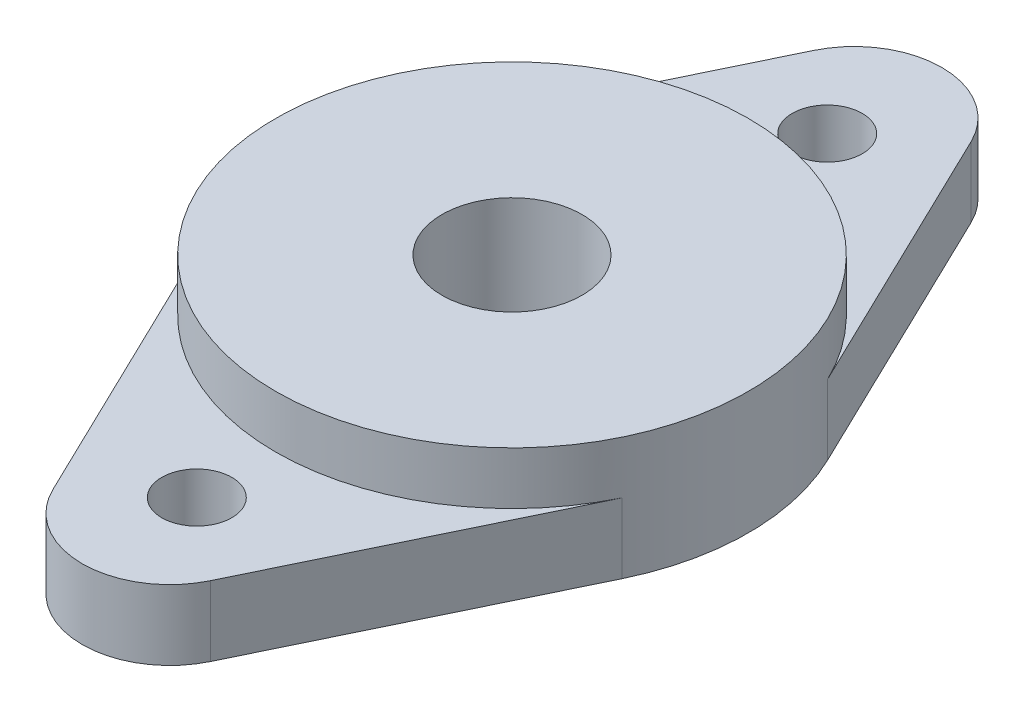
ISO-10303-21;
HEADER;
FILE_DESCRIPTION(('STEP AP214'),'2;1');
FILE_NAME('part.step','',(''),(''),'','','');
FILE_SCHEMA(('AUTOMOTIVE_DESIGN { 1 0 10303 214 1 1 1 1 }'));
ENDSEC;
DATA;
#1=APPLICATION_CONTEXT('core data for automotive mechanical design processes');
#2=APPLICATION_PROTOCOL_DEFINITION('international standard','automotive_design',2000,#1);
#3=PRODUCT_CONTEXT('',#1,'mechanical');
#4=PRODUCT('Part','Part','',(#3));
#5=PRODUCT_RELATED_PRODUCT_CATEGORY('part','',(#4));
#6=PRODUCT_DEFINITION_FORMATION('','',#4);
#7=PRODUCT_DEFINITION_CONTEXT('part definition',#1,'design');
#8=PRODUCT_DEFINITION('design','',#6,#7);
#9=PRODUCT_DEFINITION_SHAPE('','',#8);
#10=(LENGTH_UNIT() NAMED_UNIT(*) SI_UNIT(.MILLI.,.METRE.));
#11=(NAMED_UNIT(*) PLANE_ANGLE_UNIT() SI_UNIT($,.RADIAN.));
#12=(NAMED_UNIT(*) SI_UNIT($,.STERADIAN.) SOLID_ANGLE_UNIT());
#13=UNCERTAINTY_MEASURE_WITH_UNIT(LENGTH_MEASURE(1.E-05),#10,'distance_accuracy_value','');
#14=(GEOMETRIC_REPRESENTATION_CONTEXT(3) GLOBAL_UNCERTAINTY_ASSIGNED_CONTEXT((#13)) GLOBAL_UNIT_ASSIGNED_CONTEXT((#10,
#11,#12)) REPRESENTATION_CONTEXT('',''));
#15=CARTESIAN_POINT('',(0.,0.,0.));
#16=DIRECTION('',(0.,0.,1.));
#17=DIRECTION('',(1.,0.,0.));
#18=AXIS2_PLACEMENT_3D('',#15,#16,#17);
#19=CARTESIAN_POINT('',(0.,4.,0.));
#20=DIRECTION('',(0.,1.,0.));
#21=DIRECTION('',(0.,0.,1.));
#22=AXIS2_PLACEMENT_3D('',#19,#20,#21);
#23=PLANE('',#22);
#24=CARTESIAN_POINT('',(0.,4.,0.));
#25=DIRECTION('',(0.,1.,0.));
#26=DIRECTION('',(0.,0.,1.));
#27=AXIS2_PLACEMENT_3D('',#24,#25,#26);
#28=CIRCLE('',#27,13.5);
#29=CARTESIAN_POINT('',(12.1564372844206,4.,-5.87120367130518));
#30=VERTEX_POINT('',#29);
#31=CARTESIAN_POINT('',(-12.1564372844206,4.,-5.87120367130518));
#32=VERTEX_POINT('',#31);
#33=EDGE_CURVE('E11',#30,#32,#28,.T.);
#34=ORIENTED_EDGE('',*,*,#33,.F.);
#35=DIRECTION('',(-0.434903975652235,0.,-0.900476835883012));
#36=VECTOR('',#35,1.);
#37=CARTESIAN_POINT('',(12.1564372844206,4.,-5.87120367130516));
#38=LINE('',#37,#36);
#39=CARTESIAN_POINT('',(4.50238417941506,4.,-21.7190641359961));
#40=VERTEX_POINT('',#39);
#41=EDGE_CURVE('E155',#30,#40,#38,.T.);
#42=ORIENTED_EDGE('',*,*,#41,.T.);
#43=CARTESIAN_POINT('',(0.,4.,-19.5445442577349));
#44=DIRECTION('',(0.,1.,0.));
#45=DIRECTION('',(0.,0.,1.));
#46=AXIS2_PLACEMENT_3D('',#43,#44,#45);
#47=CIRCLE('',#46,5.);
#48=CARTESIAN_POINT('',(-4.50238417941506,4.,-21.7190641359961));
#49=VERTEX_POINT('',#48);
#50=EDGE_CURVE('E133',#40,#49,#47,.T.);
#51=ORIENTED_EDGE('',*,*,#50,.T.);
#52=DIRECTION('',(-0.434903975652235,0.,0.900476835883012));
#53=VECTOR('',#52,1.);
#54=CARTESIAN_POINT('',(-12.1564372844206,4.,-5.87120367130516));
#55=LINE('',#54,#53);
#56=EDGE_CURVE('E130',#49,#32,#55,.T.);
#57=ORIENTED_EDGE('',*,*,#56,.T.);
#58=EDGE_LOOP('',(#34,#42,#51,#57));
#59=FACE_BOUND('',#58,.T.);
#60=CARTESIAN_POINT('',(0.,4.,-18.));
#61=DIRECTION('',(0.,1.,0.));
#62=DIRECTION('',(0.,0.,1.));
#63=AXIS2_PLACEMENT_3D('',#60,#61,#62);
#64=CIRCLE('',#63,2.);
#65=CARTESIAN_POINT('',(0.,4.,-16.));
#66=VERTEX_POINT('',#65);
#67=EDGE_CURVE('E211',#66,#66,#64,.T.);
#68=ORIENTED_EDGE('',*,*,#67,.F.);
#69=EDGE_LOOP('',(#68));
#70=FACE_BOUND('',#69,.T.);
#71=ADVANCED_FACE('F35',(#59,#70),#23,.T.);
#72=CARTESIAN_POINT('',(12.1564372844206,4.,-5.87120367130516));
#73=DIRECTION('',(-0.900476835883012,0.,0.434903975652235));
#74=DIRECTION('',(0.434903975652235,0.,0.900476835883012));
#75=AXIS2_PLACEMENT_3D('',#72,#73,#74);
#76=PLANE('',#75);
#77=DIRECTION('',(-0.434903975652235,0.,-0.900476835883012));
#78=VECTOR('',#77,1.);
#79=CARTESIAN_POINT('',(12.1564372844206,0.,-5.87120367130516));
#80=LINE('',#79,#78);
#81=CARTESIAN_POINT('',(12.1564372844206,0.,-5.87120367130518));
#82=VERTEX_POINT('',#81);
#83=CARTESIAN_POINT('',(4.50238417941506,0.,-21.7190641359961));
#84=VERTEX_POINT('',#83);
#85=EDGE_CURVE('E140',#82,#84,#80,.T.);
#86=ORIENTED_EDGE('',*,*,#85,.T.);
#87=DIRECTION('',(0.,-1.,0.));
#88=VECTOR('',#87,1.);
#89=CARTESIAN_POINT('',(4.50238417941506,4.,-21.7190641359961));
#90=LINE('',#89,#88);
#91=EDGE_CURVE('E162',#40,#84,#90,.T.);
#92=ORIENTED_EDGE('',*,*,#91,.F.);
#93=ORIENTED_EDGE('',*,*,#41,.F.);
#94=DIRECTION('',(0.,-1.,0.));
#95=VECTOR('',#94,1.);
#96=CARTESIAN_POINT('',(12.1564372844206,4.,-5.87120367130518));
#97=LINE('',#96,#95);
#98=EDGE_CURVE('E39',#30,#82,#97,.T.);
#99=ORIENTED_EDGE('',*,*,#98,.T.);
#100=EDGE_LOOP('',(#86,#92,#93,#99));
#101=FACE_BOUND('',#100,.T.);
#102=ADVANCED_FACE('F37',(#101),#76,.F.);
#103=CARTESIAN_POINT('',(0.,4.,-19.5445442577349));
#104=DIRECTION('',(0.,-1.,0.));
#105=DIRECTION('',(0.,0.,-1.));
#106=AXIS2_PLACEMENT_3D('',#103,#104,#105);
#107=CYLINDRICAL_SURFACE('',#106,5.);
#108=CARTESIAN_POINT('',(0.,0.,-19.5445442577349));
#109=DIRECTION('',(0.,1.,0.));
#110=DIRECTION('',(0.,0.,1.));
#111=AXIS2_PLACEMENT_3D('',#108,#109,#110);
#112=CIRCLE('',#111,5.);
#113=CARTESIAN_POINT('',(-4.50238417941506,0.,-21.7190641359961));
#114=VERTEX_POINT('',#113);
#115=EDGE_CURVE('E143',#84,#114,#112,.T.);
#116=ORIENTED_EDGE('',*,*,#115,.T.);
#117=DIRECTION('',(0.,-1.,0.));
#118=VECTOR('',#117,1.);
#119=CARTESIAN_POINT('',(-4.50238417941506,4.,-21.7190641359961));
#120=LINE('',#119,#118);
#121=EDGE_CURVE('E160',#49,#114,#120,.T.);
#122=ORIENTED_EDGE('',*,*,#121,.F.);
#123=ORIENTED_EDGE('',*,*,#50,.F.);
#124=ORIENTED_EDGE('',*,*,#91,.T.);
#125=EDGE_LOOP('',(#116,#122,#123,#124));
#126=FACE_BOUND('',#125,.T.);
#127=ADVANCED_FACE('F188',(#126),#107,.T.);
#128=CARTESIAN_POINT('',(-12.1564372844206,4.,-5.87120367130516));
#129=DIRECTION('',(0.900476835883012,0.,0.434903975652235));
#130=DIRECTION('',(0.434903975652235,0.,-0.900476835883012));
#131=AXIS2_PLACEMENT_3D('',#128,#129,#130);
#132=PLANE('',#131);
#133=DIRECTION('',(-0.434903975652235,0.,0.900476835883012));
#134=VECTOR('',#133,1.);
#135=CARTESIAN_POINT('',(-12.1564372844206,0.,-5.87120367130516));
#136=LINE('',#135,#134);
#137=CARTESIAN_POINT('',(-12.1564372844206,0.,-5.87120367130518));
#138=VERTEX_POINT('',#137);
#139=EDGE_CURVE('E145',#114,#138,#136,.T.);
#140=ORIENTED_EDGE('',*,*,#139,.T.);
#141=DIRECTION('',(0.,-1.,0.));
#142=VECTOR('',#141,1.);
#143=CARTESIAN_POINT('',(-12.1564372844206,4.,-5.87120367130518));
#144=LINE('',#143,#142);
#145=EDGE_CURVE('E125',#32,#138,#144,.T.);
#146=ORIENTED_EDGE('',*,*,#145,.F.);
#147=ORIENTED_EDGE('',*,*,#56,.F.);
#148=ORIENTED_EDGE('',*,*,#121,.T.);
#149=EDGE_LOOP('',(#140,#146,#147,#148));
#150=FACE_BOUND('',#149,.T.);
#151=ADVANCED_FACE('F225',(#150),#132,.F.);
#152=CARTESIAN_POINT('',(0.,4.,0.));
#153=DIRECTION('',(0.,-1.,0.));
#154=DIRECTION('',(0.,0.,-1.));
#155=AXIS2_PLACEMENT_3D('',#152,#153,#154);
#156=CYLINDRICAL_SURFACE('',#155,13.5);
#157=CARTESIAN_POINT('',(0.,0.,0.));
#158=DIRECTION('',(0.,1.,0.));
#159=DIRECTION('',(0.,0.,1.));
#160=AXIS2_PLACEMENT_3D('',#157,#158,#159);
#161=CIRCLE('',#160,13.5);
#162=CARTESIAN_POINT('',(-12.1564372844206,0.,5.87120367130518));
#163=VERTEX_POINT('',#162);
#164=EDGE_CURVE('E121',#138,#163,#161,.T.);
#165=ORIENTED_EDGE('',*,*,#164,.T.);
#166=DIRECTION('',(0.,-1.,0.));
#167=VECTOR('',#166,1.);
#168=CARTESIAN_POINT('',(-12.1564372844206,4.,5.87120367130518));
#169=LINE('',#168,#167);
#170=CARTESIAN_POINT('',(-12.1564372844206,4.,5.87120367130518));
#171=VERTEX_POINT('',#170);
#172=EDGE_CURVE('E116',#171,#163,#169,.T.);
#173=ORIENTED_EDGE('',*,*,#172,.F.);
#174=CARTESIAN_POINT('',(12.1564372844207,4.,5.87120367130517));
#175=VERTEX_POINT('',#174);
#176=EDGE_CURVE('E45',#171,#175,#28,.T.);
#177=ORIENTED_EDGE('',*,*,#176,.T.);
#178=DIRECTION('',(0.,-1.,0.));
#179=VECTOR('',#178,1.);
#180=CARTESIAN_POINT('',(12.1564372844206,4.,5.87120367130518));
#181=LINE('',#180,#179);
#182=CARTESIAN_POINT('',(12.1564372844206,0.,5.87120367130518));
#183=VERTEX_POINT('',#182);
#184=EDGE_CURVE('E89',#175,#183,#181,.T.);
#185=ORIENTED_EDGE('',*,*,#184,.T.);
#186=EDGE_CURVE('E138',#183,#82,#161,.T.);
#187=ORIENTED_EDGE('',*,*,#186,.T.);
#188=ORIENTED_EDGE('',*,*,#98,.F.);
#189=ORIENTED_EDGE('',*,*,#33,.T.);
#190=ORIENTED_EDGE('',*,*,#145,.T.);
#191=EDGE_LOOP('',(#165,#173,#177,#185,#187,#188,#189,#190));
#192=FACE_BOUND('',#191,.T.);
#193=CARTESIAN_POINT('',(0.,7.,0.));
#194=DIRECTION('',(0.,1.,0.));
#195=DIRECTION('',(0.,0.,1.));
#196=AXIS2_PLACEMENT_3D('',#193,#194,#195);
#197=CIRCLE('',#196,13.5);
#198=CARTESIAN_POINT('',(0.,7.,13.5));
#199=VERTEX_POINT('',#198);
#200=EDGE_CURVE('E216',#199,#199,#197,.T.);
#201=ORIENTED_EDGE('',*,*,#200,.F.);
#202=EDGE_LOOP('',(#201));
#203=FACE_BOUND('',#202,.T.);
#204=ADVANCED_FACE('F117',(#192,#203),#156,.T.);
#205=CARTESIAN_POINT('',(-12.1564372844206,4.,5.87120367130516));
#206=DIRECTION('',(-0.900476835883012,0.,0.434903975652235));
#207=DIRECTION('',(0.434903975652235,0.,0.900476835883012));
#208=AXIS2_PLACEMENT_3D('',#205,#206,#207);
#209=PLANE('',#208);
#210=DIRECTION('',(-0.434903975652235,0.,-0.900476835883012));
#211=VECTOR('',#210,1.);
#212=CARTESIAN_POINT('',(-12.1564372844206,0.,5.87120367130516));
#213=LINE('',#212,#211);
#214=CARTESIAN_POINT('',(-4.50238417941506,0.,21.7190641359961));
#215=VERTEX_POINT('',#214);
#216=EDGE_CURVE('E147',#215,#163,#213,.T.);
#217=ORIENTED_EDGE('',*,*,#216,.F.);
#218=DIRECTION('',(0.,-1.,0.));
#219=VECTOR('',#218,1.);
#220=CARTESIAN_POINT('',(-4.50238417941506,4.,21.7190641359961));
#221=LINE('',#220,#219);
#222=CARTESIAN_POINT('',(-4.50238417941506,4.,21.7190641359961));
#223=VERTEX_POINT('',#222);
#224=EDGE_CURVE('E126',#223,#215,#221,.T.);
#225=ORIENTED_EDGE('',*,*,#224,.F.);
#226=DIRECTION('',(-0.434903975652235,0.,-0.900476835883012));
#227=VECTOR('',#226,1.);
#228=CARTESIAN_POINT('',(-12.1564372844206,4.,5.87120367130516));
#229=LINE('',#228,#227);
#230=EDGE_CURVE('E113',#223,#171,#229,.T.);
#231=ORIENTED_EDGE('',*,*,#230,.T.);
#232=ORIENTED_EDGE('',*,*,#172,.T.);
#233=EDGE_LOOP('',(#217,#225,#231,#232));
#234=FACE_BOUND('',#233,.T.);
#235=ADVANCED_FACE('F128',(#234),#209,.T.);
#236=CARTESIAN_POINT('',(0.,4.,19.5445442577349));
#237=DIRECTION('',(0.,-1.,0.));
#238=DIRECTION('',(0.,0.,-1.));
#239=AXIS2_PLACEMENT_3D('',#236,#237,#238);
#240=CYLINDRICAL_SURFACE('',#239,5.);
#241=CARTESIAN_POINT('',(0.,0.,19.5445442577349));
#242=DIRECTION('',(0.,1.,0.));
#243=DIRECTION('',(0.,0.,1.));
#244=AXIS2_PLACEMENT_3D('',#241,#242,#243);
#245=CIRCLE('',#244,5.);
#246=CARTESIAN_POINT('',(4.50238417941506,0.,21.7190641359961));
#247=VERTEX_POINT('',#246);
#248=EDGE_CURVE('E149',#247,#215,#245,.F.);
#249=ORIENTED_EDGE('',*,*,#248,.F.);
#250=DIRECTION('',(0.,-1.,0.));
#251=VECTOR('',#250,1.);
#252=CARTESIAN_POINT('',(4.50238417941506,4.,21.7190641359961));
#253=LINE('',#252,#251);
#254=CARTESIAN_POINT('',(4.50238417941506,4.,21.7190641359961));
#255=VERTEX_POINT('',#254);
#256=EDGE_CURVE('E54',#255,#247,#253,.T.);
#257=ORIENTED_EDGE('',*,*,#256,.F.);
#258=CARTESIAN_POINT('',(0.,4.,19.5445442577349));
#259=DIRECTION('',(0.,1.,0.));
#260=DIRECTION('',(0.,0.,1.));
#261=AXIS2_PLACEMENT_3D('',#258,#259,#260);
#262=CIRCLE('',#261,5.);
#263=EDGE_CURVE('E129',#255,#223,#262,.F.);
#264=ORIENTED_EDGE('',*,*,#263,.T.);
#265=ORIENTED_EDGE('',*,*,#224,.T.);
#266=EDGE_LOOP('',(#249,#257,#264,#265));
#267=FACE_BOUND('',#266,.T.);
#268=ADVANCED_FACE('F175',(#267),#240,.T.);
#269=CARTESIAN_POINT('',(12.1564372844206,4.,5.87120367130516));
#270=DIRECTION('',(0.900476835883012,0.,0.434903975652235));
#271=DIRECTION('',(0.434903975652235,0.,-0.900476835883012));
#272=AXIS2_PLACEMENT_3D('',#269,#270,#271);
#273=PLANE('',#272);
#274=DIRECTION('',(-0.434903975652235,0.,0.900476835883012));
#275=VECTOR('',#274,1.);
#276=CARTESIAN_POINT('',(12.1564372844206,0.,5.87120367130516));
#277=LINE('',#276,#275);
#278=EDGE_CURVE('E152',#183,#247,#277,.T.);
#279=ORIENTED_EDGE('',*,*,#278,.F.);
#280=ORIENTED_EDGE('',*,*,#184,.F.);
#281=DIRECTION('',(-0.434903975652235,0.,0.900476835883012));
#282=VECTOR('',#281,1.);
#283=CARTESIAN_POINT('',(12.1564372844206,4.,5.87120367130516));
#284=LINE('',#283,#282);
#285=EDGE_CURVE('E114',#175,#255,#284,.T.);
#286=ORIENTED_EDGE('',*,*,#285,.T.);
#287=ORIENTED_EDGE('',*,*,#256,.T.);
#288=EDGE_LOOP('',(#279,#280,#286,#287));
#289=FACE_BOUND('',#288,.T.);
#290=ADVANCED_FACE('F173',(#289),#273,.T.);
#291=ORIENTED_EDGE('',*,*,#176,.F.);
#292=ORIENTED_EDGE('',*,*,#230,.F.);
#293=ORIENTED_EDGE('',*,*,#263,.F.);
#294=ORIENTED_EDGE('',*,*,#285,.F.);
#295=EDGE_LOOP('',(#291,#292,#293,#294));
#296=FACE_BOUND('',#295,.T.);
#297=CARTESIAN_POINT('',(0.,4.,18.));
#298=DIRECTION('',(0.,1.,0.));
#299=DIRECTION('',(0.,0.,1.));
#300=AXIS2_PLACEMENT_3D('',#297,#298,#299);
#301=CIRCLE('',#300,2.);
#302=CARTESIAN_POINT('',(0.,4.,20.));
#303=VERTEX_POINT('',#302);
#304=EDGE_CURVE('E210',#303,#303,#301,.T.);
#305=ORIENTED_EDGE('',*,*,#304,.F.);
#306=EDGE_LOOP('',(#305));
#307=FACE_BOUND('',#306,.T.);
#308=ADVANCED_FACE('F110',(#296,#307),#23,.T.);
#309=CARTESIAN_POINT('',(0.,0.,0.));
#310=DIRECTION('',(0.,1.,0.));
#311=DIRECTION('',(0.,0.,1.));
#312=AXIS2_PLACEMENT_3D('',#309,#310,#311);
#313=PLANE('',#312);
#314=CARTESIAN_POINT('',(0.,0.,0.));
#315=DIRECTION('',(0.,1.,0.));
#316=DIRECTION('',(0.,0.,1.));
#317=AXIS2_PLACEMENT_3D('',#314,#315,#316);
#318=CIRCLE('',#317,4.);
#319=CARTESIAN_POINT('',(0.,0.,4.));
#320=VERTEX_POINT('',#319);
#321=EDGE_CURVE('E203',#320,#320,#318,.T.);
#322=ORIENTED_EDGE('',*,*,#321,.T.);
#323=EDGE_LOOP('',(#322));
#324=FACE_BOUND('',#323,.T.);
#325=CARTESIAN_POINT('',(0.,0.,18.));
#326=DIRECTION('',(0.,1.,0.));
#327=DIRECTION('',(0.,0.,1.));
#328=AXIS2_PLACEMENT_3D('',#325,#326,#327);
#329=CIRCLE('',#328,2.);
#330=CARTESIAN_POINT('',(0.,0.,20.));
#331=VERTEX_POINT('',#330);
#332=EDGE_CURVE('E141',#331,#331,#329,.T.);
#333=ORIENTED_EDGE('',*,*,#332,.T.);
#334=EDGE_LOOP('',(#333));
#335=FACE_BOUND('',#334,.T.);
#336=CARTESIAN_POINT('',(0.,0.,-18.));
#337=DIRECTION('',(0.,1.,0.));
#338=DIRECTION('',(0.,0.,1.));
#339=AXIS2_PLACEMENT_3D('',#336,#337,#338);
#340=CIRCLE('',#339,2.);
#341=CARTESIAN_POINT('',(0.,0.,-16.));
#342=VERTEX_POINT('',#341);
#343=EDGE_CURVE('E209',#342,#342,#340,.T.);
#344=ORIENTED_EDGE('',*,*,#343,.T.);
#345=EDGE_LOOP('',(#344));
#346=FACE_BOUND('',#345,.T.);
#347=ORIENTED_EDGE('',*,*,#186,.F.);
#348=ORIENTED_EDGE('',*,*,#278,.T.);
#349=ORIENTED_EDGE('',*,*,#248,.T.);
#350=ORIENTED_EDGE('',*,*,#216,.T.);
#351=ORIENTED_EDGE('',*,*,#164,.F.);
#352=ORIENTED_EDGE('',*,*,#139,.F.);
#353=ORIENTED_EDGE('',*,*,#115,.F.);
#354=ORIENTED_EDGE('',*,*,#85,.F.);
#355=EDGE_LOOP('',(#347,#348,#349,#350,#351,#352,#353,#354));
#356=FACE_BOUND('',#355,.T.);
#357=ADVANCED_FACE('F172',(#324,#335,#346,#356),#313,.F.);
#358=CARTESIAN_POINT('',(0.,0.,-18.));
#359=DIRECTION('',(0.,1.,0.));
#360=DIRECTION('',(0.,0.,1.));
#361=AXIS2_PLACEMENT_3D('',#358,#359,#360);
#362=CYLINDRICAL_SURFACE('',#361,2.);
#363=ORIENTED_EDGE('',*,*,#343,.F.);
#364=EDGE_LOOP('',(#363));
#365=FACE_BOUND('',#364,.T.);
#366=ORIENTED_EDGE('',*,*,#67,.T.);
#367=EDGE_LOOP('',(#366));
#368=FACE_BOUND('',#367,.T.);
#369=ADVANCED_FACE('F191',(#365,#368),#362,.F.);
#370=CARTESIAN_POINT('',(0.,0.,18.));
#371=DIRECTION('',(0.,1.,0.));
#372=DIRECTION('',(0.,0.,1.));
#373=AXIS2_PLACEMENT_3D('',#370,#371,#372);
#374=CYLINDRICAL_SURFACE('',#373,2.);
#375=ORIENTED_EDGE('',*,*,#332,.F.);
#376=EDGE_LOOP('',(#375));
#377=FACE_BOUND('',#376,.T.);
#378=ORIENTED_EDGE('',*,*,#304,.T.);
#379=EDGE_LOOP('',(#378));
#380=FACE_BOUND('',#379,.T.);
#381=ADVANCED_FACE('F198',(#377,#380),#374,.F.);
#382=CARTESIAN_POINT('',(0.,7.,0.));
#383=DIRECTION('',(0.,1.,0.));
#384=DIRECTION('',(0.,0.,1.));
#385=AXIS2_PLACEMENT_3D('',#382,#383,#384);
#386=PLANE('',#385);
#387=CARTESIAN_POINT('',(0.,7.,0.));
#388=DIRECTION('',(0.,1.,0.));
#389=DIRECTION('',(0.,0.,1.));
#390=AXIS2_PLACEMENT_3D('',#387,#388,#389);
#391=CIRCLE('',#390,4.);
#392=CARTESIAN_POINT('',(0.,7.,4.));
#393=VERTEX_POINT('',#392);
#394=EDGE_CURVE('E320',#393,#393,#391,.T.);
#395=ORIENTED_EDGE('',*,*,#394,.F.);
#396=EDGE_LOOP('',(#395));
#397=FACE_BOUND('',#396,.T.);
#398=ORIENTED_EDGE('',*,*,#200,.T.);
#399=EDGE_LOOP('',(#398));
#400=FACE_BOUND('',#399,.T.);
#401=ADVANCED_FACE('F267',(#397,#400),#386,.T.);
#402=CARTESIAN_POINT('',(0.,0.,0.));
#403=DIRECTION('',(0.,1.,0.));
#404=DIRECTION('',(0.,0.,1.));
#405=AXIS2_PLACEMENT_3D('',#402,#403,#404);
#406=CYLINDRICAL_SURFACE('',#405,4.);
#407=ORIENTED_EDGE('',*,*,#321,.F.);
#408=EDGE_LOOP('',(#407));
#409=FACE_BOUND('',#408,.T.);
#410=ORIENTED_EDGE('',*,*,#394,.T.);
#411=EDGE_LOOP('',(#410));
#412=FACE_BOUND('',#411,.T.);
#413=ADVANCED_FACE('F304',(#409,#412),#406,.F.);
#414=CLOSED_SHELL('',(#71,#102,#127,#151,#204,#235,#268,#290,#308,#357,#369,#381,#401,#413));
#415=MANIFOLD_SOLID_BREP('B2',#414);
#416=ADVANCED_BREP_SHAPE_REPRESENTATION('',(#18,#415),#14);
#417=SHAPE_DEFINITION_REPRESENTATION(#9,#416);
ENDSEC;
END-ISO-10303-21;
